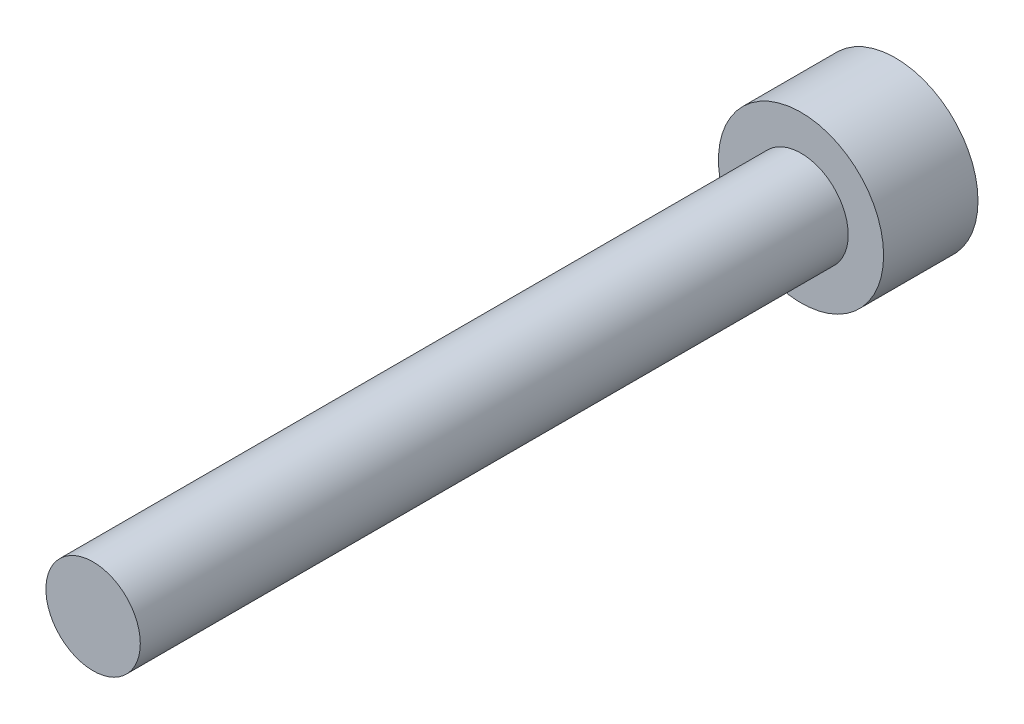
ISO-10303-21;
HEADER;
FILE_DESCRIPTION(('STEP AP214'),'2;1');
FILE_NAME('part.step','',(''),(''),'','','');
FILE_SCHEMA(('AUTOMOTIVE_DESIGN { 1 0 10303 214 1 1 1 1 }'));
ENDSEC;
DATA;
#1=APPLICATION_CONTEXT('core data for automotive mechanical design processes');
#2=APPLICATION_PROTOCOL_DEFINITION('international standard','automotive_design',2000,#1);
#3=PRODUCT_CONTEXT('',#1,'mechanical');
#4=PRODUCT('Part','Part','',(#3));
#5=PRODUCT_RELATED_PRODUCT_CATEGORY('part','',(#4));
#6=PRODUCT_DEFINITION_FORMATION('','',#4);
#7=PRODUCT_DEFINITION_CONTEXT('part definition',#1,'design');
#8=PRODUCT_DEFINITION('design','',#6,#7);
#9=PRODUCT_DEFINITION_SHAPE('','',#8);
#10=(LENGTH_UNIT() NAMED_UNIT(*) SI_UNIT(.MILLI.,.METRE.));
#11=(NAMED_UNIT(*) PLANE_ANGLE_UNIT() SI_UNIT($,.RADIAN.));
#12=(NAMED_UNIT(*) SI_UNIT($,.STERADIAN.) SOLID_ANGLE_UNIT());
#13=UNCERTAINTY_MEASURE_WITH_UNIT(LENGTH_MEASURE(1.E-05),#10,'distance_accuracy_value','');
#14=(GEOMETRIC_REPRESENTATION_CONTEXT(3) GLOBAL_UNCERTAINTY_ASSIGNED_CONTEXT((#13)) GLOBAL_UNIT_ASSIGNED_CONTEXT((#10,
#11,#12)) REPRESENTATION_CONTEXT('',''));
#15=CARTESIAN_POINT('',(0.,0.,0.));
#16=DIRECTION('',(0.,0.,1.));
#17=DIRECTION('',(1.,0.,0.));
#18=AXIS2_PLACEMENT_3D('',#15,#16,#17);
#19=CARTESIAN_POINT('',(0.,0.,-4.));
#20=DIRECTION('',(0.,0.,1.));
#21=DIRECTION('',(1.,0.,0.));
#22=AXIS2_PLACEMENT_3D('',#19,#20,#21);
#23=PLANE('',#22);
#24=CARTESIAN_POINT('',(0.,0.,-4.));
#25=DIRECTION('',(0.,0.,1.));
#26=DIRECTION('',(1.,0.,0.));
#27=AXIS2_PLACEMENT_3D('',#24,#25,#26);
#28=CIRCLE('',#27,3.5);
#29=CARTESIAN_POINT('',(3.5,0.,-4.));
#30=VERTEX_POINT('',#29);
#31=EDGE_CURVE('E47',#30,#30,#28,.T.);
#32=ORIENTED_EDGE('',*,*,#31,.F.);
#33=EDGE_LOOP('',(#32));
#34=FACE_BOUND('',#33,.T.);
#35=DIRECTION('',(0.5,0.866025403784439,0.));
#36=VECTOR('',#35,1.);
#37=CARTESIAN_POINT('',(0.866025403784439,-1.5,-4.));
#38=LINE('',#37,#36);
#39=CARTESIAN_POINT('',(0.866025403784439,-1.5,-4.));
#40=VERTEX_POINT('',#39);
#41=CARTESIAN_POINT('',(1.73205080756888,0.,-4.));
#42=VERTEX_POINT('',#41);
#43=EDGE_CURVE('E62',#40,#42,#38,.T.);
#44=ORIENTED_EDGE('',*,*,#43,.T.);
#45=DIRECTION('',(-0.5,0.866025403784439,0.));
#46=VECTOR('',#45,1.);
#47=CARTESIAN_POINT('',(1.73205080756888,0.,-4.));
#48=LINE('',#47,#46);
#49=CARTESIAN_POINT('',(0.866025403784439,1.5,-4.));
#50=VERTEX_POINT('',#49);
#51=EDGE_CURVE('E138',#42,#50,#48,.T.);
#52=ORIENTED_EDGE('',*,*,#51,.T.);
#53=DIRECTION('',(-1.,0.,0.));
#54=VECTOR('',#53,1.);
#55=CARTESIAN_POINT('',(0.866025403784439,1.5,-4.));
#56=LINE('',#55,#54);
#57=CARTESIAN_POINT('',(-0.866025403784438,1.5,-4.));
#58=VERTEX_POINT('',#57);
#59=EDGE_CURVE('E141',#50,#58,#56,.T.);
#60=ORIENTED_EDGE('',*,*,#59,.T.);
#61=DIRECTION('',(-0.5,-0.866025403784439,0.));
#62=VECTOR('',#61,1.);
#63=CARTESIAN_POINT('',(-0.866025403784438,1.5,-4.));
#64=LINE('',#63,#62);
#65=CARTESIAN_POINT('',(-1.73205080756888,0.,-4.));
#66=VERTEX_POINT('',#65);
#67=EDGE_CURVE('E150',#58,#66,#64,.T.);
#68=ORIENTED_EDGE('',*,*,#67,.T.);
#69=DIRECTION('',(0.5,-0.866025403784439,0.));
#70=VECTOR('',#69,1.);
#71=CARTESIAN_POINT('',(-1.73205080756888,0.,-4.));
#72=LINE('',#71,#70);
#73=CARTESIAN_POINT('',(-0.866025403784439,-1.5,-4.));
#74=VERTEX_POINT('',#73);
#75=EDGE_CURVE('E125',#66,#74,#72,.T.);
#76=ORIENTED_EDGE('',*,*,#75,.T.);
#77=DIRECTION('',(1.,0.,0.));
#78=VECTOR('',#77,1.);
#79=CARTESIAN_POINT('',(-0.866025403784439,-1.5,-4.));
#80=LINE('',#79,#78);
#81=EDGE_CURVE('E155',#74,#40,#80,.T.);
#82=ORIENTED_EDGE('',*,*,#81,.T.);
#83=EDGE_LOOP('',(#44,#52,#60,#68,#76,#82));
#84=FACE_BOUND('',#83,.T.);
#85=ADVANCED_FACE('F44',(#34,#84),#23,.F.);
#86=CARTESIAN_POINT('',(0.,0.,0.));
#87=DIRECTION('',(0.,0.,-1.));
#88=DIRECTION('',(-1.,0.,0.));
#89=AXIS2_PLACEMENT_3D('',#86,#87,#88);
#90=CYLINDRICAL_SURFACE('',#89,3.5);
#91=CARTESIAN_POINT('',(0.,0.,0.));
#92=DIRECTION('',(0.,0.,1.));
#93=DIRECTION('',(1.,0.,0.));
#94=AXIS2_PLACEMENT_3D('',#91,#92,#93);
#95=CIRCLE('',#94,3.5);
#96=CARTESIAN_POINT('',(3.5,0.,0.));
#97=VERTEX_POINT('',#96);
#98=EDGE_CURVE('E54',#97,#97,#95,.T.);
#99=ORIENTED_EDGE('',*,*,#98,.F.);
#100=EDGE_LOOP('',(#99));
#101=FACE_BOUND('',#100,.T.);
#102=ORIENTED_EDGE('',*,*,#31,.T.);
#103=EDGE_LOOP('',(#102));
#104=FACE_BOUND('',#103,.T.);
#105=ADVANCED_FACE('F50',(#101,#104),#90,.T.);
#106=CARTESIAN_POINT('',(0.,0.,0.));
#107=DIRECTION('',(0.,0.,1.));
#108=DIRECTION('',(1.,0.,0.));
#109=AXIS2_PLACEMENT_3D('',#106,#107,#108);
#110=PLANE('',#109);
#111=CARTESIAN_POINT('',(0.,0.,0.));
#112=DIRECTION('',(0.,0.,1.));
#113=DIRECTION('',(1.,0.,0.));
#114=AXIS2_PLACEMENT_3D('',#111,#112,#113);
#115=CIRCLE('',#114,2.);
#116=CARTESIAN_POINT('',(2.,0.,0.));
#117=VERTEX_POINT('',#116);
#118=EDGE_CURVE('E11',#117,#117,#115,.T.);
#119=ORIENTED_EDGE('',*,*,#118,.F.);
#120=EDGE_LOOP('',(#119));
#121=FACE_BOUND('',#120,.T.);
#122=ORIENTED_EDGE('',*,*,#98,.T.);
#123=EDGE_LOOP('',(#122));
#124=FACE_BOUND('',#123,.T.);
#125=ADVANCED_FACE('F212',(#121,#124),#110,.T.);
#126=CARTESIAN_POINT('',(0.,0.,30.));
#127=DIRECTION('',(0.,0.,-1.));
#128=DIRECTION('',(-1.,0.,0.));
#129=AXIS2_PLACEMENT_3D('',#126,#127,#128);
#130=CYLINDRICAL_SURFACE('',#129,2.);
#131=CARTESIAN_POINT('',(0.,0.,30.));
#132=DIRECTION('',(0.,0.,1.));
#133=DIRECTION('',(1.,0.,0.));
#134=AXIS2_PLACEMENT_3D('',#131,#132,#133);
#135=CIRCLE('',#134,2.);
#136=CARTESIAN_POINT('',(2.,0.,30.));
#137=VERTEX_POINT('',#136);
#138=EDGE_CURVE('E166',#137,#137,#135,.T.);
#139=ORIENTED_EDGE('',*,*,#138,.F.);
#140=EDGE_LOOP('',(#139));
#141=FACE_BOUND('',#140,.T.);
#142=ORIENTED_EDGE('',*,*,#118,.T.);
#143=EDGE_LOOP('',(#142));
#144=FACE_BOUND('',#143,.T.);
#145=ADVANCED_FACE('F209',(#141,#144),#130,.T.);
#146=CARTESIAN_POINT('',(0.,0.,30.));
#147=DIRECTION('',(0.,0.,1.));
#148=DIRECTION('',(1.,0.,0.));
#149=AXIS2_PLACEMENT_3D('',#146,#147,#148);
#150=PLANE('',#149);
#151=ORIENTED_EDGE('',*,*,#138,.T.);
#152=EDGE_LOOP('',(#151));
#153=FACE_BOUND('',#152,.T.);
#154=ADVANCED_FACE('F204',(#153),#150,.T.);
#155=CARTESIAN_POINT('',(0.866025403784439,-1.5,-2.));
#156=DIRECTION('',(-0.866025403784439,0.5,0.));
#157=DIRECTION('',(-0.5,-0.866025403784439,0.));
#158=AXIS2_PLACEMENT_3D('',#155,#156,#157);
#159=PLANE('',#158);
#160=ORIENTED_EDGE('',*,*,#43,.F.);
#161=DIRECTION('',(0.,0.,-1.));
#162=VECTOR('',#161,1.);
#163=CARTESIAN_POINT('',(0.866025403784439,-1.5,-2.));
#164=LINE('',#163,#162);
#165=CARTESIAN_POINT('',(0.866025403784439,-1.5,-2.));
#166=VERTEX_POINT('',#165);
#167=EDGE_CURVE('E132',#166,#40,#164,.T.);
#168=ORIENTED_EDGE('',*,*,#167,.F.);
#169=DIRECTION('',(0.5,0.866025403784439,0.));
#170=VECTOR('',#169,1.);
#171=CARTESIAN_POINT('',(0.866025403784439,-1.5,-2.));
#172=LINE('',#171,#170);
#173=CARTESIAN_POINT('',(1.73205080756888,0.,-2.));
#174=VERTEX_POINT('',#173);
#175=EDGE_CURVE('E156',#166,#174,#172,.T.);
#176=ORIENTED_EDGE('',*,*,#175,.T.);
#177=DIRECTION('',(0.,0.,-1.));
#178=VECTOR('',#177,1.);
#179=CARTESIAN_POINT('',(1.73205080756888,0.,-2.));
#180=LINE('',#179,#178);
#181=EDGE_CURVE('E167',#174,#42,#180,.T.);
#182=ORIENTED_EDGE('',*,*,#181,.T.);
#183=EDGE_LOOP('',(#160,#168,#176,#182));
#184=FACE_BOUND('',#183,.T.);
#185=ADVANCED_FACE('F184',(#184),#159,.T.);
#186=CARTESIAN_POINT('',(1.73205080756888,0.,-2.));
#187=DIRECTION('',(-0.866025403784439,-0.5,0.));
#188=DIRECTION('',(0.5,-0.866025403784439,0.));
#189=AXIS2_PLACEMENT_3D('',#186,#187,#188);
#190=PLANE('',#189);
#191=ORIENTED_EDGE('',*,*,#51,.F.);
#192=ORIENTED_EDGE('',*,*,#181,.F.);
#193=DIRECTION('',(-0.5,0.866025403784439,0.));
#194=VECTOR('',#193,1.);
#195=CARTESIAN_POINT('',(1.73205080756888,0.,-2.));
#196=LINE('',#195,#194);
#197=CARTESIAN_POINT('',(0.866025403784439,1.5,-2.));
#198=VERTEX_POINT('',#197);
#199=EDGE_CURVE('E105',#174,#198,#196,.T.);
#200=ORIENTED_EDGE('',*,*,#199,.T.);
#201=DIRECTION('',(0.,0.,-1.));
#202=VECTOR('',#201,1.);
#203=CARTESIAN_POINT('',(0.866025403784439,1.5,-2.));
#204=LINE('',#203,#202);
#205=EDGE_CURVE('E162',#198,#50,#204,.T.);
#206=ORIENTED_EDGE('',*,*,#205,.T.);
#207=EDGE_LOOP('',(#191,#192,#200,#206));
#208=FACE_BOUND('',#207,.T.);
#209=ADVANCED_FACE('F198',(#208),#190,.T.);
#210=CARTESIAN_POINT('',(0.866025403784439,1.5,-2.));
#211=DIRECTION('',(0.,-1.,0.));
#212=DIRECTION('',(1.,0.,0.));
#213=AXIS2_PLACEMENT_3D('',#210,#211,#212);
#214=PLANE('',#213);
#215=ORIENTED_EDGE('',*,*,#59,.F.);
#216=ORIENTED_EDGE('',*,*,#205,.F.);
#217=DIRECTION('',(-1.,0.,0.));
#218=VECTOR('',#217,1.);
#219=CARTESIAN_POINT('',(0.866025403784439,1.5,-2.));
#220=LINE('',#219,#218);
#221=CARTESIAN_POINT('',(-0.866025403784438,1.5,-2.));
#222=VERTEX_POINT('',#221);
#223=EDGE_CURVE('E121',#198,#222,#220,.T.);
#224=ORIENTED_EDGE('',*,*,#223,.T.);
#225=DIRECTION('',(0.,0.,-1.));
#226=VECTOR('',#225,1.);
#227=CARTESIAN_POINT('',(-0.866025403784438,1.5,-2.));
#228=LINE('',#227,#226);
#229=EDGE_CURVE('E119',#222,#58,#228,.T.);
#230=ORIENTED_EDGE('',*,*,#229,.T.);
#231=EDGE_LOOP('',(#215,#216,#224,#230));
#232=FACE_BOUND('',#231,.T.);
#233=ADVANCED_FACE('F193',(#232),#214,.T.);
#234=CARTESIAN_POINT('',(-0.866025403784438,1.5,-2.));
#235=DIRECTION('',(0.866025403784439,-0.5,0.));
#236=DIRECTION('',(0.5,0.866025403784439,0.));
#237=AXIS2_PLACEMENT_3D('',#234,#235,#236);
#238=PLANE('',#237);
#239=ORIENTED_EDGE('',*,*,#67,.F.);
#240=ORIENTED_EDGE('',*,*,#229,.F.);
#241=DIRECTION('',(-0.5,-0.866025403784439,0.));
#242=VECTOR('',#241,1.);
#243=CARTESIAN_POINT('',(-0.866025403784438,1.5,-2.));
#244=LINE('',#243,#242);
#245=CARTESIAN_POINT('',(-1.73205080756888,0.,-2.));
#246=VERTEX_POINT('',#245);
#247=EDGE_CURVE('E115',#222,#246,#244,.T.);
#248=ORIENTED_EDGE('',*,*,#247,.T.);
#249=DIRECTION('',(0.,0.,-1.));
#250=VECTOR('',#249,1.);
#251=CARTESIAN_POINT('',(-1.73205080756888,0.,-2.));
#252=LINE('',#251,#250);
#253=EDGE_CURVE('E118',#246,#66,#252,.T.);
#254=ORIENTED_EDGE('',*,*,#253,.T.);
#255=EDGE_LOOP('',(#239,#240,#248,#254));
#256=FACE_BOUND('',#255,.T.);
#257=ADVANCED_FACE('F113',(#256),#238,.T.);
#258=CARTESIAN_POINT('',(-1.73205080756888,0.,-2.));
#259=DIRECTION('',(0.866025403784439,0.5,0.));
#260=DIRECTION('',(-0.5,0.866025403784439,0.));
#261=AXIS2_PLACEMENT_3D('',#258,#259,#260);
#262=PLANE('',#261);
#263=ORIENTED_EDGE('',*,*,#75,.F.);
#264=ORIENTED_EDGE('',*,*,#253,.F.);
#265=DIRECTION('',(0.5,-0.866025403784439,0.));
#266=VECTOR('',#265,1.);
#267=CARTESIAN_POINT('',(-1.73205080756888,0.,-2.));
#268=LINE('',#267,#266);
#269=CARTESIAN_POINT('',(-0.866025403784439,-1.5,-2.));
#270=VERTEX_POINT('',#269);
#271=EDGE_CURVE('E116',#246,#270,#268,.T.);
#272=ORIENTED_EDGE('',*,*,#271,.T.);
#273=DIRECTION('',(0.,0.,-1.));
#274=VECTOR('',#273,1.);
#275=CARTESIAN_POINT('',(-0.866025403784439,-1.5,-2.));
#276=LINE('',#275,#274);
#277=EDGE_CURVE('E91',#270,#74,#276,.T.);
#278=ORIENTED_EDGE('',*,*,#277,.T.);
#279=EDGE_LOOP('',(#263,#264,#272,#278));
#280=FACE_BOUND('',#279,.T.);
#281=ADVANCED_FACE('F124',(#280),#262,.T.);
#282=CARTESIAN_POINT('',(-0.866025403784439,-1.5,-2.));
#283=DIRECTION('',(0.,1.,0.));
#284=DIRECTION('',(-1.,0.,0.));
#285=AXIS2_PLACEMENT_3D('',#282,#283,#284);
#286=PLANE('',#285);
#287=ORIENTED_EDGE('',*,*,#81,.F.);
#288=ORIENTED_EDGE('',*,*,#277,.F.);
#289=DIRECTION('',(1.,0.,0.));
#290=VECTOR('',#289,1.);
#291=CARTESIAN_POINT('',(-0.866025403784439,-1.5,-2.));
#292=LINE('',#291,#290);
#293=EDGE_CURVE('E72',#270,#166,#292,.T.);
#294=ORIENTED_EDGE('',*,*,#293,.T.);
#295=ORIENTED_EDGE('',*,*,#167,.T.);
#296=EDGE_LOOP('',(#287,#288,#294,#295));
#297=FACE_BOUND('',#296,.T.);
#298=ADVANCED_FACE('F181',(#297),#286,.T.);
#299=CARTESIAN_POINT('',(0.,0.,-2.));
#300=DIRECTION('',(0.,0.,1.));
#301=DIRECTION('',(1.,0.,0.));
#302=AXIS2_PLACEMENT_3D('',#299,#300,#301);
#303=PLANE('',#302);
#304=ORIENTED_EDGE('',*,*,#175,.F.);
#305=ORIENTED_EDGE('',*,*,#293,.F.);
#306=ORIENTED_EDGE('',*,*,#271,.F.);
#307=ORIENTED_EDGE('',*,*,#247,.F.);
#308=ORIENTED_EDGE('',*,*,#223,.F.);
#309=ORIENTED_EDGE('',*,*,#199,.F.);
#310=EDGE_LOOP('',(#304,#305,#306,#307,#308,#309));
#311=FACE_BOUND('',#310,.T.);
#312=ADVANCED_FACE('F129',(#311),#303,.F.);
#313=CLOSED_SHELL('',(#85,#105,#125,#145,#154,#185,#209,#233,#257,#281,#298,#312));
#314=MANIFOLD_SOLID_BREP('B2',#313);
#315=ADVANCED_BREP_SHAPE_REPRESENTATION('',(#18,#314),#14);
#316=SHAPE_DEFINITION_REPRESENTATION(#9,#315);
ENDSEC;
END-ISO-10303-21;
